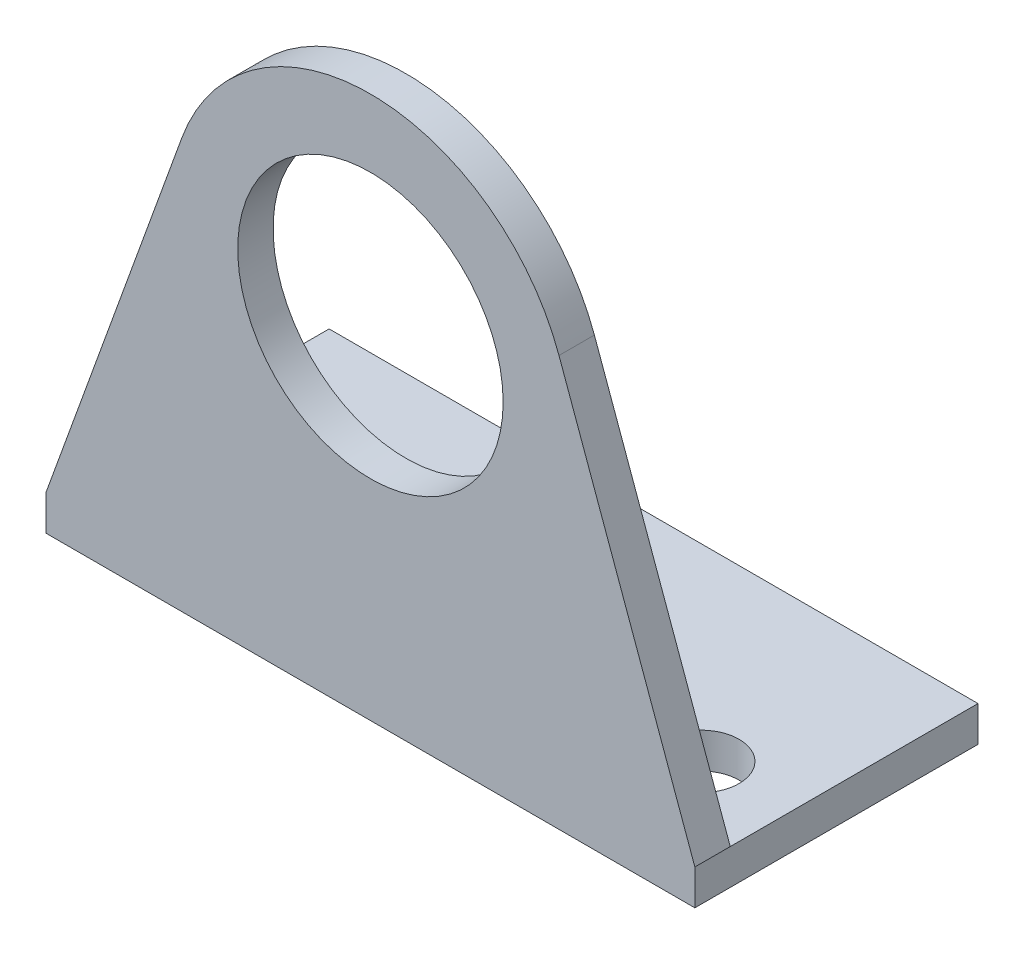
ISO-10303-21;
HEADER;
FILE_DESCRIPTION(('STEP AP214'),'2;1');
FILE_NAME('part.step','',(''),(''),'','','');
FILE_SCHEMA(('AUTOMOTIVE_DESIGN { 1 0 10303 214 1 1 1 1 }'));
ENDSEC;
DATA;
#1=APPLICATION_CONTEXT('core data for automotive mechanical design processes');
#2=APPLICATION_PROTOCOL_DEFINITION('international standard','automotive_design',2000,#1);
#3=PRODUCT_CONTEXT('',#1,'mechanical');
#4=PRODUCT('Part','Part','',(#3));
#5=PRODUCT_RELATED_PRODUCT_CATEGORY('part','',(#4));
#6=PRODUCT_DEFINITION_FORMATION('','',#4);
#7=PRODUCT_DEFINITION_CONTEXT('part definition',#1,'design');
#8=PRODUCT_DEFINITION('design','',#6,#7);
#9=PRODUCT_DEFINITION_SHAPE('','',#8);
#10=(LENGTH_UNIT() NAMED_UNIT(*) SI_UNIT(.MILLI.,.METRE.));
#11=(NAMED_UNIT(*) PLANE_ANGLE_UNIT() SI_UNIT($,.RADIAN.));
#12=(NAMED_UNIT(*) SI_UNIT($,.STERADIAN.) SOLID_ANGLE_UNIT());
#13=UNCERTAINTY_MEASURE_WITH_UNIT(LENGTH_MEASURE(1.E-05),#10,'distance_accuracy_value','');
#14=(GEOMETRIC_REPRESENTATION_CONTEXT(3) GLOBAL_UNCERTAINTY_ASSIGNED_CONTEXT((#13)) GLOBAL_UNIT_ASSIGNED_CONTEXT((#10,
#11,#12)) REPRESENTATION_CONTEXT('',''));
#15=CARTESIAN_POINT('',(0.,0.,0.));
#16=DIRECTION('',(0.,0.,1.));
#17=DIRECTION('',(1.,0.,0.));
#18=AXIS2_PLACEMENT_3D('',#15,#16,#17);
#19=CARTESIAN_POINT('',(0.,3.,0.));
#20=DIRECTION('',(0.,-1.,0.));
#21=DIRECTION('',(0.,0.,-1.));
#22=AXIS2_PLACEMENT_3D('',#19,#20,#21);
#23=PLANE('',#22);
#24=DIRECTION('',(0.,0.,1.));
#25=VECTOR('',#24,1.);
#26=CARTESIAN_POINT('',(0.,3.,0.));
#27=LINE('',#26,#25);
#28=CARTESIAN_POINT('',(0.,3.,-24.));
#29=VERTEX_POINT('',#28);
#30=CARTESIAN_POINT('',(0.,3.,-3.));
#31=VERTEX_POINT('',#30);
#32=EDGE_CURVE('E88',#29,#31,#27,.T.);
#33=ORIENTED_EDGE('',*,*,#32,.T.);
#34=DIRECTION('',(1.,0.,0.));
#35=VECTOR('',#34,1.);
#36=CARTESIAN_POINT('',(0.,3.,-3.));
#37=LINE('',#36,#35);
#38=CARTESIAN_POINT('',(55.,3.,-3.));
#39=VERTEX_POINT('',#38);
#40=EDGE_CURVE('E154',#31,#39,#37,.T.);
#41=ORIENTED_EDGE('',*,*,#40,.T.);
#42=DIRECTION('',(0.,0.,-1.));
#43=VECTOR('',#42,1.);
#44=CARTESIAN_POINT('',(55.,3.,0.));
#45=LINE('',#44,#43);
#46=CARTESIAN_POINT('',(55.,3.,-24.));
#47=VERTEX_POINT('',#46);
#48=EDGE_CURVE('E165',#39,#47,#45,.T.);
#49=ORIENTED_EDGE('',*,*,#48,.T.);
#50=DIRECTION('',(-1.,0.,0.));
#51=VECTOR('',#50,1.);
#52=CARTESIAN_POINT('',(0.,3.,-24.));
#53=LINE('',#52,#51);
#54=EDGE_CURVE('E59',#47,#29,#53,.T.);
#55=ORIENTED_EDGE('',*,*,#54,.T.);
#56=EDGE_LOOP('',(#33,#41,#49,#55));
#57=FACE_BOUND('',#56,.T.);
#58=CARTESIAN_POINT('',(47.5,3.,-8.));
#59=DIRECTION('',(0.,1.,0.));
#60=DIRECTION('',(0.,0.,1.));
#61=AXIS2_PLACEMENT_3D('',#58,#59,#60);
#62=CIRCLE('',#61,3.25);
#63=CARTESIAN_POINT('',(47.5,3.,-4.75));
#64=VERTEX_POINT('',#63);
#65=EDGE_CURVE('E100',#64,#64,#62,.T.);
#66=ORIENTED_EDGE('',*,*,#65,.F.);
#67=EDGE_LOOP('',(#66));
#68=FACE_BOUND('',#67,.T.);
#69=CARTESIAN_POINT('',(7.5,3.,-8.));
#70=DIRECTION('',(0.,1.,0.));
#71=DIRECTION('',(0.,0.,1.));
#72=AXIS2_PLACEMENT_3D('',#69,#70,#71);
#73=CIRCLE('',#72,3.25);
#74=CARTESIAN_POINT('',(7.5,3.,-4.75));
#75=VERTEX_POINT('',#74);
#76=EDGE_CURVE('E180',#75,#75,#73,.T.);
#77=ORIENTED_EDGE('',*,*,#76,.F.);
#78=EDGE_LOOP('',(#77));
#79=FACE_BOUND('',#78,.T.);
#80=ADVANCED_FACE('F35',(#57,#68,#79),#23,.F.);
#81=CARTESIAN_POINT('',(0.,0.,0.));
#82=DIRECTION('',(0.,-1.,0.));
#83=DIRECTION('',(0.,0.,-1.));
#84=AXIS2_PLACEMENT_3D('',#81,#82,#83);
#85=PLANE('',#84);
#86=CARTESIAN_POINT('',(47.5,0.,-8.));
#87=DIRECTION('',(0.,1.,0.));
#88=DIRECTION('',(0.,0.,1.));
#89=AXIS2_PLACEMENT_3D('',#86,#87,#88);
#90=CIRCLE('',#89,3.25);
#91=CARTESIAN_POINT('',(47.5,0.,-4.75));
#92=VERTEX_POINT('',#91);
#93=EDGE_CURVE('E104',#92,#92,#90,.T.);
#94=ORIENTED_EDGE('',*,*,#93,.T.);
#95=EDGE_LOOP('',(#94));
#96=FACE_BOUND('',#95,.T.);
#97=DIRECTION('',(0.,0.,1.));
#98=VECTOR('',#97,1.);
#99=CARTESIAN_POINT('',(0.,0.,0.));
#100=LINE('',#99,#98);
#101=CARTESIAN_POINT('',(0.,0.,-24.));
#102=VERTEX_POINT('',#101);
#103=CARTESIAN_POINT('',(0.,0.,0.));
#104=VERTEX_POINT('',#103);
#105=EDGE_CURVE('E94',#102,#104,#100,.T.);
#106=ORIENTED_EDGE('',*,*,#105,.F.);
#107=DIRECTION('',(-1.,0.,0.));
#108=VECTOR('',#107,1.);
#109=CARTESIAN_POINT('',(0.,0.,-24.));
#110=LINE('',#109,#108);
#111=CARTESIAN_POINT('',(55.,0.,-24.));
#112=VERTEX_POINT('',#111);
#113=EDGE_CURVE('E78',#112,#102,#110,.T.);
#114=ORIENTED_EDGE('',*,*,#113,.F.);
#115=DIRECTION('',(0.,0.,-1.));
#116=VECTOR('',#115,1.);
#117=CARTESIAN_POINT('',(55.,0.,0.));
#118=LINE('',#117,#116);
#119=CARTESIAN_POINT('',(55.,0.,0.));
#120=VERTEX_POINT('',#119);
#121=EDGE_CURVE('E89',#120,#112,#118,.T.);
#122=ORIENTED_EDGE('',*,*,#121,.F.);
#123=DIRECTION('',(1.,0.,0.));
#124=VECTOR('',#123,1.);
#125=CARTESIAN_POINT('',(0.,0.,0.));
#126=LINE('',#125,#124);
#127=EDGE_CURVE('E99',#104,#120,#126,.T.);
#128=ORIENTED_EDGE('',*,*,#127,.F.);
#129=EDGE_LOOP('',(#106,#114,#122,#128));
#130=FACE_BOUND('',#129,.T.);
#131=CARTESIAN_POINT('',(7.5,0.,-8.));
#132=DIRECTION('',(0.,1.,0.));
#133=DIRECTION('',(0.,0.,1.));
#134=AXIS2_PLACEMENT_3D('',#131,#132,#133);
#135=CIRCLE('',#134,3.25);
#136=CARTESIAN_POINT('',(7.5,0.,-4.75));
#137=VERTEX_POINT('',#136);
#138=EDGE_CURVE('E162',#137,#137,#135,.T.);
#139=ORIENTED_EDGE('',*,*,#138,.T.);
#140=EDGE_LOOP('',(#139));
#141=FACE_BOUND('',#140,.T.);
#142=ADVANCED_FACE('F97',(#96,#130,#141),#85,.T.);
#143=CARTESIAN_POINT('',(0.,3.,0.));
#144=DIRECTION('',(1.,0.,0.));
#145=DIRECTION('',(0.,0.,-1.));
#146=AXIS2_PLACEMENT_3D('',#143,#144,#145);
#147=PLANE('',#146);
#148=ORIENTED_EDGE('',*,*,#105,.T.);
#149=DIRECTION('',(0.,-1.,0.));
#150=VECTOR('',#149,1.);
#151=CARTESIAN_POINT('',(0.,3.,0.));
#152=LINE('',#151,#150);
#153=CARTESIAN_POINT('',(0.,3.,0.));
#154=VERTEX_POINT('',#153);
#155=EDGE_CURVE('E11',#154,#104,#152,.T.);
#156=ORIENTED_EDGE('',*,*,#155,.F.);
#157=DIRECTION('',(0.,0.,1.));
#158=VECTOR('',#157,1.);
#159=CARTESIAN_POINT('',(0.,3.,-3.));
#160=LINE('',#159,#158);
#161=EDGE_CURVE('E141',#31,#154,#160,.T.);
#162=ORIENTED_EDGE('',*,*,#161,.F.);
#163=ORIENTED_EDGE('',*,*,#32,.F.);
#164=DIRECTION('',(0.,-1.,0.));
#165=VECTOR('',#164,1.);
#166=CARTESIAN_POINT('',(0.,3.,-24.));
#167=LINE('',#166,#165);
#168=EDGE_CURVE('E81',#29,#102,#167,.T.);
#169=ORIENTED_EDGE('',*,*,#168,.T.);
#170=EDGE_LOOP('',(#148,#156,#162,#163,#169));
#171=FACE_BOUND('',#170,.T.);
#172=ADVANCED_FACE('F37',(#171),#147,.F.);
#173=CARTESIAN_POINT('',(0.,3.,0.));
#174=DIRECTION('',(0.,0.,-1.));
#175=DIRECTION('',(-1.,0.,0.));
#176=AXIS2_PLACEMENT_3D('',#173,#174,#175);
#177=PLANE('',#176);
#178=ORIENTED_EDGE('',*,*,#127,.T.);
#179=DIRECTION('',(0.,-1.,0.));
#180=VECTOR('',#179,1.);
#181=CARTESIAN_POINT('',(55.,3.,0.));
#182=LINE('',#181,#180);
#183=CARTESIAN_POINT('',(55.,3.,0.));
#184=VERTEX_POINT('',#183);
#185=EDGE_CURVE('E43',#184,#120,#182,.T.);
#186=ORIENTED_EDGE('',*,*,#185,.F.);
#187=DIRECTION('',(-0.340603563238485,0.940207005243658,0.));
#188=VECTOR('',#187,1.);
#189=CARTESIAN_POINT('',(55.,3.,0.));
#190=LINE('',#189,#188);
#191=CARTESIAN_POINT('',(43.4835190891422,34.7902605750542,0.));
#192=VERTEX_POINT('',#191);
#193=EDGE_CURVE('E125',#184,#192,#190,.T.);
#194=ORIENTED_EDGE('',*,*,#193,.T.);
#195=CARTESIAN_POINT('',(27.5,29.,0.));
#196=DIRECTION('',(0.,0.,1.));
#197=DIRECTION('',(-1.,0.,0.));
#198=AXIS2_PLACEMENT_3D('',#195,#196,#197);
#199=CIRCLE('',#198,17.);
#200=CARTESIAN_POINT('',(11.5164809108578,34.7902605750542,0.));
#201=VERTEX_POINT('',#200);
#202=EDGE_CURVE('E174',#192,#201,#199,.T.);
#203=ORIENTED_EDGE('',*,*,#202,.T.);
#204=DIRECTION('',(-0.340603563238484,-0.940207005243658,0.));
#205=VECTOR('',#204,1.);
#206=CARTESIAN_POINT('',(0.,3.,0.));
#207=LINE('',#206,#205);
#208=EDGE_CURVE('E157',#201,#154,#207,.T.);
#209=ORIENTED_EDGE('',*,*,#208,.T.);
#210=ORIENTED_EDGE('',*,*,#155,.T.);
#211=EDGE_LOOP('',(#178,#186,#194,#203,#209,#210));
#212=FACE_BOUND('',#211,.T.);
#213=CARTESIAN_POINT('',(27.5,29.,0.));
#214=DIRECTION('',(0.,0.,1.));
#215=DIRECTION('',(1.,0.,0.));
#216=AXIS2_PLACEMENT_3D('',#213,#214,#215);
#217=CIRCLE('',#216,11.25);
#218=CARTESIAN_POINT('',(38.75,29.,0.));
#219=VERTEX_POINT('',#218);
#220=EDGE_CURVE('E299',#219,#219,#217,.T.);
#221=ORIENTED_EDGE('',*,*,#220,.F.);
#222=EDGE_LOOP('',(#221));
#223=FACE_BOUND('',#222,.T.);
#224=ADVANCED_FACE('F120',(#212,#223),#177,.F.);
#225=CARTESIAN_POINT('',(55.,3.,0.));
#226=DIRECTION('',(-1.,0.,0.));
#227=DIRECTION('',(0.,0.,1.));
#228=AXIS2_PLACEMENT_3D('',#225,#226,#227);
#229=PLANE('',#228);
#230=ORIENTED_EDGE('',*,*,#121,.T.);
#231=DIRECTION('',(0.,-1.,0.));
#232=VECTOR('',#231,1.);
#233=CARTESIAN_POINT('',(55.,3.,-24.));
#234=LINE('',#233,#232);
#235=EDGE_CURVE('E84',#47,#112,#234,.T.);
#236=ORIENTED_EDGE('',*,*,#235,.F.);
#237=ORIENTED_EDGE('',*,*,#48,.F.);
#238=EDGE_CURVE('E117',#184,#39,#45,.T.);
#239=ORIENTED_EDGE('',*,*,#238,.F.);
#240=ORIENTED_EDGE('',*,*,#185,.T.);
#241=EDGE_LOOP('',(#230,#236,#237,#239,#240));
#242=FACE_BOUND('',#241,.T.);
#243=ADVANCED_FACE('F114',(#242),#229,.F.);
#244=CARTESIAN_POINT('',(0.,3.,-24.));
#245=DIRECTION('',(0.,0.,1.));
#246=DIRECTION('',(1.,0.,0.));
#247=AXIS2_PLACEMENT_3D('',#244,#245,#246);
#248=PLANE('',#247);
#249=ORIENTED_EDGE('',*,*,#113,.T.);
#250=ORIENTED_EDGE('',*,*,#168,.F.);
#251=ORIENTED_EDGE('',*,*,#54,.F.);
#252=ORIENTED_EDGE('',*,*,#235,.T.);
#253=EDGE_LOOP('',(#249,#250,#251,#252));
#254=FACE_BOUND('',#253,.T.);
#255=ADVANCED_FACE('F80',(#254),#248,.F.);
#256=CARTESIAN_POINT('',(47.5,3.,-8.));
#257=DIRECTION('',(0.,-1.,0.));
#258=DIRECTION('',(0.,0.,-1.));
#259=AXIS2_PLACEMENT_3D('',#256,#257,#258);
#260=CYLINDRICAL_SURFACE('',#259,3.25);
#261=ORIENTED_EDGE('',*,*,#65,.T.);
#262=EDGE_LOOP('',(#261));
#263=FACE_BOUND('',#262,.T.);
#264=ORIENTED_EDGE('',*,*,#93,.F.);
#265=EDGE_LOOP('',(#264));
#266=FACE_BOUND('',#265,.T.);
#267=ADVANCED_FACE('F188',(#263,#266),#260,.F.);
#268=CARTESIAN_POINT('',(7.5,3.,-8.));
#269=DIRECTION('',(0.,-1.,0.));
#270=DIRECTION('',(0.,0.,-1.));
#271=AXIS2_PLACEMENT_3D('',#268,#269,#270);
#272=CYLINDRICAL_SURFACE('',#271,3.25);
#273=ORIENTED_EDGE('',*,*,#76,.T.);
#274=EDGE_LOOP('',(#273));
#275=FACE_BOUND('',#274,.T.);
#276=ORIENTED_EDGE('',*,*,#138,.F.);
#277=EDGE_LOOP('',(#276));
#278=FACE_BOUND('',#277,.T.);
#279=ADVANCED_FACE('F186',(#275,#278),#272,.F.);
#280=CARTESIAN_POINT('',(0.,3.,-3.));
#281=DIRECTION('',(-0.940207005243658,0.340603563238484,0.));
#282=DIRECTION('',(-0.340603563238484,-0.940207005243658,0.));
#283=AXIS2_PLACEMENT_3D('',#280,#281,#282);
#284=PLANE('',#283);
#285=ORIENTED_EDGE('',*,*,#208,.F.);
#286=DIRECTION('',(0.,0.,1.));
#287=VECTOR('',#286,1.);
#288=CARTESIAN_POINT('',(11.5164809108578,34.7902605750542,-3.));
#289=LINE('',#288,#287);
#290=CARTESIAN_POINT('',(11.5164809108578,34.7902605750542,-3.));
#291=VERTEX_POINT('',#290);
#292=EDGE_CURVE('E151',#291,#201,#289,.T.);
#293=ORIENTED_EDGE('',*,*,#292,.F.);
#294=DIRECTION('',(-0.340603563238484,-0.940207005243658,0.));
#295=VECTOR('',#294,1.);
#296=CARTESIAN_POINT('',(0.,3.,-3.));
#297=LINE('',#296,#295);
#298=EDGE_CURVE('E156',#291,#31,#297,.T.);
#299=ORIENTED_EDGE('',*,*,#298,.T.);
#300=ORIENTED_EDGE('',*,*,#161,.T.);
#301=EDGE_LOOP('',(#285,#293,#299,#300));
#302=FACE_BOUND('',#301,.T.);
#303=ADVANCED_FACE('F159',(#302),#284,.T.);
#304=CARTESIAN_POINT('',(27.5,29.,-3.));
#305=DIRECTION('',(0.,0.,1.));
#306=DIRECTION('',(1.,0.,0.));
#307=AXIS2_PLACEMENT_3D('',#304,#305,#306);
#308=CYLINDRICAL_SURFACE('',#307,17.);
#309=ORIENTED_EDGE('',*,*,#202,.F.);
#310=DIRECTION('',(0.,0.,1.));
#311=VECTOR('',#310,1.);
#312=CARTESIAN_POINT('',(43.4835190891422,34.7902605750542,-3.));
#313=LINE('',#312,#311);
#314=CARTESIAN_POINT('',(43.4835190891422,34.7902605750542,-3.));
#315=VERTEX_POINT('',#314);
#316=EDGE_CURVE('E149',#315,#192,#313,.T.);
#317=ORIENTED_EDGE('',*,*,#316,.F.);
#318=CARTESIAN_POINT('',(27.5,29.,-3.));
#319=DIRECTION('',(0.,0.,1.));
#320=DIRECTION('',(-1.,0.,0.));
#321=AXIS2_PLACEMENT_3D('',#318,#319,#320);
#322=CIRCLE('',#321,17.);
#323=EDGE_CURVE('E160',#315,#291,#322,.T.);
#324=ORIENTED_EDGE('',*,*,#323,.T.);
#325=ORIENTED_EDGE('',*,*,#292,.T.);
#326=EDGE_LOOP('',(#309,#317,#324,#325));
#327=FACE_BOUND('',#326,.T.);
#328=ADVANCED_FACE('F195',(#327),#308,.T.);
#329=CARTESIAN_POINT('',(55.,3.,-3.));
#330=DIRECTION('',(0.940207005243658,0.340603563238485,0.));
#331=DIRECTION('',(-0.340603563238485,0.940207005243658,0.));
#332=AXIS2_PLACEMENT_3D('',#329,#330,#331);
#333=PLANE('',#332);
#334=ORIENTED_EDGE('',*,*,#193,.F.);
#335=ORIENTED_EDGE('',*,*,#238,.T.);
#336=DIRECTION('',(-0.340603563238485,0.940207005243658,0.));
#337=VECTOR('',#336,1.);
#338=CARTESIAN_POINT('',(55.,3.,-3.));
#339=LINE('',#338,#337);
#340=EDGE_CURVE('E50',#39,#315,#339,.T.);
#341=ORIENTED_EDGE('',*,*,#340,.T.);
#342=ORIENTED_EDGE('',*,*,#316,.T.);
#343=EDGE_LOOP('',(#334,#335,#341,#342));
#344=FACE_BOUND('',#343,.T.);
#345=ADVANCED_FACE('F168',(#344),#333,.T.);
#346=CARTESIAN_POINT('',(27.5,29.,-3.));
#347=DIRECTION('',(0.,0.,-1.));
#348=DIRECTION('',(-1.,0.,0.));
#349=AXIS2_PLACEMENT_3D('',#346,#347,#348);
#350=PLANE('',#349);
#351=CARTESIAN_POINT('',(27.5,29.,-3.));
#352=DIRECTION('',(0.,0.,1.));
#353=DIRECTION('',(1.,0.,0.));
#354=AXIS2_PLACEMENT_3D('',#351,#352,#353);
#355=CIRCLE('',#354,11.25);
#356=CARTESIAN_POINT('',(38.75,29.,-3.));
#357=VERTEX_POINT('',#356);
#358=EDGE_CURVE('E175',#357,#357,#355,.T.);
#359=ORIENTED_EDGE('',*,*,#358,.T.);
#360=EDGE_LOOP('',(#359));
#361=FACE_BOUND('',#360,.T.);
#362=ORIENTED_EDGE('',*,*,#40,.F.);
#363=ORIENTED_EDGE('',*,*,#298,.F.);
#364=ORIENTED_EDGE('',*,*,#323,.F.);
#365=ORIENTED_EDGE('',*,*,#340,.F.);
#366=EDGE_LOOP('',(#362,#363,#364,#365));
#367=FACE_BOUND('',#366,.T.);
#368=ADVANCED_FACE('F155',(#361,#367),#350,.T.);
#369=CARTESIAN_POINT('',(27.5,29.,-3.));
#370=DIRECTION('',(0.,0.,1.));
#371=DIRECTION('',(1.,0.,0.));
#372=AXIS2_PLACEMENT_3D('',#369,#370,#371);
#373=CYLINDRICAL_SURFACE('',#372,11.25);
#374=ORIENTED_EDGE('',*,*,#358,.F.);
#375=EDGE_LOOP('',(#374));
#376=FACE_BOUND('',#375,.T.);
#377=ORIENTED_EDGE('',*,*,#220,.T.);
#378=EDGE_LOOP('',(#377));
#379=FACE_BOUND('',#378,.T.);
#380=ADVANCED_FACE('F278',(#376,#379),#373,.F.);
#381=CLOSED_SHELL('',(#80,#142,#172,#224,#243,#255,#267,#279,#303,#328,#345,#368,#380));
#382=MANIFOLD_SOLID_BREP('B2',#381);
#383=ADVANCED_BREP_SHAPE_REPRESENTATION('',(#18,#382),#14);
#384=SHAPE_DEFINITION_REPRESENTATION(#9,#383);
ENDSEC;
END-ISO-10303-21;
